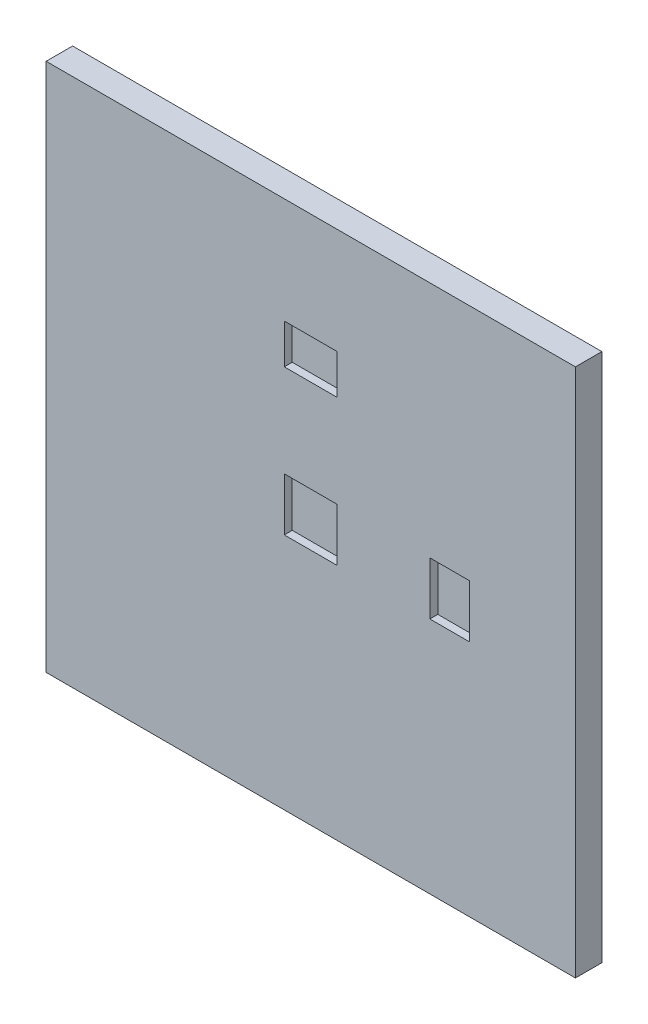
ISO-10303-21;
HEADER;
FILE_DESCRIPTION(('STEP AP214'),'2;1');
FILE_NAME('part.step','',(''),(''),'','','');
FILE_SCHEMA(('AUTOMOTIVE_DESIGN { 1 0 10303 214 1 1 1 1 }'));
ENDSEC;
DATA;
#1=APPLICATION_CONTEXT('core data for automotive mechanical design processes');
#2=APPLICATION_PROTOCOL_DEFINITION('international standard','automotive_design',2000,#1);
#3=PRODUCT_CONTEXT('',#1,'mechanical');
#4=PRODUCT('Part','Part','',(#3));
#5=PRODUCT_RELATED_PRODUCT_CATEGORY('part','',(#4));
#6=PRODUCT_DEFINITION_FORMATION('','',#4);
#7=PRODUCT_DEFINITION_CONTEXT('part definition',#1,'design');
#8=PRODUCT_DEFINITION('design','',#6,#7);
#9=PRODUCT_DEFINITION_SHAPE('','',#8);
#10=(LENGTH_UNIT() NAMED_UNIT(*) SI_UNIT(.MILLI.,.METRE.));
#11=(NAMED_UNIT(*) PLANE_ANGLE_UNIT() SI_UNIT($,.RADIAN.));
#12=(NAMED_UNIT(*) SI_UNIT($,.STERADIAN.) SOLID_ANGLE_UNIT());
#13=UNCERTAINTY_MEASURE_WITH_UNIT(LENGTH_MEASURE(1.E-05),#10,'distance_accuracy_value','');
#14=(GEOMETRIC_REPRESENTATION_CONTEXT(3) GLOBAL_UNCERTAINTY_ASSIGNED_CONTEXT((#13)) GLOBAL_UNIT_ASSIGNED_CONTEXT((#10,
#11,#12)) REPRESENTATION_CONTEXT('',''));
#15=CARTESIAN_POINT('',(0.,0.,0.));
#16=DIRECTION('',(0.,0.,1.));
#17=DIRECTION('',(1.,0.,0.));
#18=AXIS2_PLACEMENT_3D('',#15,#16,#17);
#19=CARTESIAN_POINT('',(0.,0.,10.));
#20=DIRECTION('',(-1.,0.,0.));
#21=DIRECTION('',(0.,-1.,0.));
#22=AXIS2_PLACEMENT_3D('',#19,#20,#21);
#23=PLANE('',#22);
#24=DIRECTION('',(0.,1.,0.));
#25=VECTOR('',#24,1.);
#26=CARTESIAN_POINT('',(0.,0.,0.));
#27=LINE('',#26,#25);
#28=CARTESIAN_POINT('',(0.,-200.,0.));
#29=VERTEX_POINT('',#28);
#30=CARTESIAN_POINT('',(0.,0.,0.));
#31=VERTEX_POINT('',#30);
#32=EDGE_CURVE('E279',#29,#31,#27,.T.);
#33=ORIENTED_EDGE('',*,*,#32,.T.);
#34=DIRECTION('',(0.,0.,-1.));
#35=VECTOR('',#34,1.);
#36=CARTESIAN_POINT('',(0.,0.,10.));
#37=LINE('',#36,#35);
#38=CARTESIAN_POINT('',(0.,0.,10.));
#39=VERTEX_POINT('',#38);
#40=EDGE_CURVE('E11',#39,#31,#37,.T.);
#41=ORIENTED_EDGE('',*,*,#40,.F.);
#42=DIRECTION('',(0.,1.,0.));
#43=VECTOR('',#42,1.);
#44=CARTESIAN_POINT('',(0.,0.,10.));
#45=LINE('',#44,#43);
#46=CARTESIAN_POINT('',(0.,-200.,10.));
#47=VERTEX_POINT('',#46);
#48=EDGE_CURVE('E289',#47,#39,#45,.T.);
#49=ORIENTED_EDGE('',*,*,#48,.F.);
#50=DIRECTION('',(0.,0.,-1.));
#51=VECTOR('',#50,1.);
#52=CARTESIAN_POINT('',(0.,-200.,10.));
#53=LINE('',#52,#51);
#54=EDGE_CURVE('E303',#47,#29,#53,.T.);
#55=ORIENTED_EDGE('',*,*,#54,.T.);
#56=EDGE_LOOP('',(#33,#41,#49,#55));
#57=FACE_BOUND('',#56,.T.);
#58=ADVANCED_FACE('F39',(#57),#23,.F.);
#59=CARTESIAN_POINT('',(0.,0.,10.));
#60=DIRECTION('',(0.,-1.,0.));
#61=DIRECTION('',(0.,0.,-1.));
#62=AXIS2_PLACEMENT_3D('',#59,#60,#61);
#63=PLANE('',#62);
#64=DIRECTION('',(-1.,0.,0.));
#65=VECTOR('',#64,1.);
#66=CARTESIAN_POINT('',(0.,0.,0.));
#67=LINE('',#66,#65);
#68=CARTESIAN_POINT('',(-200.,0.,0.));
#69=VERTEX_POINT('',#68);
#70=EDGE_CURVE('E307',#31,#69,#67,.T.);
#71=ORIENTED_EDGE('',*,*,#70,.T.);
#72=DIRECTION('',(0.,0.,-1.));
#73=VECTOR('',#72,1.);
#74=CARTESIAN_POINT('',(-200.,0.,10.));
#75=LINE('',#74,#73);
#76=CARTESIAN_POINT('',(-200.,0.,10.));
#77=VERTEX_POINT('',#76);
#78=EDGE_CURVE('E47',#77,#69,#75,.T.);
#79=ORIENTED_EDGE('',*,*,#78,.F.);
#80=DIRECTION('',(-1.,0.,0.));
#81=VECTOR('',#80,1.);
#82=CARTESIAN_POINT('',(0.,0.,10.));
#83=LINE('',#82,#81);
#84=EDGE_CURVE('E293',#39,#77,#83,.T.);
#85=ORIENTED_EDGE('',*,*,#84,.F.);
#86=ORIENTED_EDGE('',*,*,#40,.T.);
#87=EDGE_LOOP('',(#71,#79,#85,#86));
#88=FACE_BOUND('',#87,.T.);
#89=ADVANCED_FACE('F343',(#88),#63,.F.);
#90=CARTESIAN_POINT('',(-200.,0.,10.));
#91=DIRECTION('',(1.,0.,0.));
#92=DIRECTION('',(0.,0.,-1.));
#93=AXIS2_PLACEMENT_3D('',#90,#91,#92);
#94=PLANE('',#93);
#95=DIRECTION('',(0.,-1.,0.));
#96=VECTOR('',#95,1.);
#97=CARTESIAN_POINT('',(-200.,0.,0.));
#98=LINE('',#97,#96);
#99=CARTESIAN_POINT('',(-200.,-200.,0.));
#100=VERTEX_POINT('',#99);
#101=EDGE_CURVE('E310',#69,#100,#98,.T.);
#102=ORIENTED_EDGE('',*,*,#101,.T.);
#103=DIRECTION('',(0.,0.,-1.));
#104=VECTOR('',#103,1.);
#105=CARTESIAN_POINT('',(-200.,-200.,10.));
#106=LINE('',#105,#104);
#107=CARTESIAN_POINT('',(-200.,-200.,10.));
#108=VERTEX_POINT('',#107);
#109=EDGE_CURVE('E318',#108,#100,#106,.T.);
#110=ORIENTED_EDGE('',*,*,#109,.F.);
#111=DIRECTION('',(0.,-1.,0.));
#112=VECTOR('',#111,1.);
#113=CARTESIAN_POINT('',(-200.,0.,10.));
#114=LINE('',#113,#112);
#115=EDGE_CURVE('E297',#77,#108,#114,.T.);
#116=ORIENTED_EDGE('',*,*,#115,.F.);
#117=ORIENTED_EDGE('',*,*,#78,.T.);
#118=EDGE_LOOP('',(#102,#110,#116,#117));
#119=FACE_BOUND('',#118,.T.);
#120=ADVANCED_FACE('F327',(#119),#94,.F.);
#121=CARTESIAN_POINT('',(0.,-200.,10.));
#122=DIRECTION('',(0.,1.,0.));
#123=DIRECTION('',(-1.,0.,0.));
#124=AXIS2_PLACEMENT_3D('',#121,#122,#123);
#125=PLANE('',#124);
#126=DIRECTION('',(1.,0.,0.));
#127=VECTOR('',#126,1.);
#128=CARTESIAN_POINT('',(0.,-200.,0.));
#129=LINE('',#128,#127);
#130=EDGE_CURVE('E294',#100,#29,#129,.T.);
#131=ORIENTED_EDGE('',*,*,#130,.T.);
#132=ORIENTED_EDGE('',*,*,#54,.F.);
#133=DIRECTION('',(1.,0.,0.));
#134=VECTOR('',#133,1.);
#135=CARTESIAN_POINT('',(0.,-200.,10.));
#136=LINE('',#135,#134);
#137=EDGE_CURVE('E300',#108,#47,#136,.T.);
#138=ORIENTED_EDGE('',*,*,#137,.F.);
#139=ORIENTED_EDGE('',*,*,#109,.T.);
#140=EDGE_LOOP('',(#131,#132,#138,#139));
#141=FACE_BOUND('',#140,.T.);
#142=ADVANCED_FACE('F336',(#141),#125,.F.);
#143=CARTESIAN_POINT('',(0.,0.,10.));
#144=DIRECTION('',(0.,0.,-1.));
#145=DIRECTION('',(-1.,0.,0.));
#146=AXIS2_PLACEMENT_3D('',#143,#144,#145);
#147=PLANE('',#146);
#148=DIRECTION('',(1.,0.,0.));
#149=VECTOR('',#148,1.);
#150=CARTESIAN_POINT('',(-110.,-55.,10.));
#151=LINE('',#150,#149);
#152=CARTESIAN_POINT('',(-110.,-55.,10.));
#153=VERTEX_POINT('',#152);
#154=CARTESIAN_POINT('',(-90.,-55.,10.));
#155=VERTEX_POINT('',#154);
#156=EDGE_CURVE('E188',#153,#155,#151,.T.);
#157=ORIENTED_EDGE('',*,*,#156,.F.);
#158=DIRECTION('',(0.,-1.,0.));
#159=VECTOR('',#158,1.);
#160=CARTESIAN_POINT('',(-110.,-40.,10.));
#161=LINE('',#160,#159);
#162=CARTESIAN_POINT('',(-110.,-40.,10.));
#163=VERTEX_POINT('',#162);
#164=EDGE_CURVE('E54',#163,#153,#161,.T.);
#165=ORIENTED_EDGE('',*,*,#164,.F.);
#166=DIRECTION('',(-1.,0.,0.));
#167=VECTOR('',#166,1.);
#168=CARTESIAN_POINT('',(-110.,-40.,10.));
#169=LINE('',#168,#167);
#170=CARTESIAN_POINT('',(-90.,-40.,10.));
#171=VERTEX_POINT('',#170);
#172=EDGE_CURVE('E175',#171,#163,#169,.T.);
#173=ORIENTED_EDGE('',*,*,#172,.F.);
#174=DIRECTION('',(0.,1.,0.));
#175=VECTOR('',#174,1.);
#176=CARTESIAN_POINT('',(-90.,-40.,10.));
#177=LINE('',#176,#175);
#178=EDGE_CURVE('E179',#155,#171,#177,.T.);
#179=ORIENTED_EDGE('',*,*,#178,.F.);
#180=EDGE_LOOP('',(#157,#165,#173,#179));
#181=FACE_BOUND('',#180,.T.);
#182=DIRECTION('',(1.,0.,0.));
#183=VECTOR('',#182,1.);
#184=CARTESIAN_POINT('',(-55.,-110.,10.));
#185=LINE('',#184,#183);
#186=CARTESIAN_POINT('',(-55.,-110.,10.));
#187=VERTEX_POINT('',#186);
#188=CARTESIAN_POINT('',(-40.,-110.,10.));
#189=VERTEX_POINT('',#188);
#190=EDGE_CURVE('E224',#187,#189,#185,.T.);
#191=ORIENTED_EDGE('',*,*,#190,.F.);
#192=DIRECTION('',(0.,-1.,0.));
#193=VECTOR('',#192,1.);
#194=CARTESIAN_POINT('',(-55.,-90.,10.));
#195=LINE('',#194,#193);
#196=CARTESIAN_POINT('',(-55.,-90.,10.));
#197=VERTEX_POINT('',#196);
#198=EDGE_CURVE('E62',#197,#187,#195,.T.);
#199=ORIENTED_EDGE('',*,*,#198,.F.);
#200=DIRECTION('',(-1.,0.,0.));
#201=VECTOR('',#200,1.);
#202=CARTESIAN_POINT('',(-55.,-90.,10.));
#203=LINE('',#202,#201);
#204=CARTESIAN_POINT('',(-40.,-90.,10.));
#205=VERTEX_POINT('',#204);
#206=EDGE_CURVE('E209',#205,#197,#203,.T.);
#207=ORIENTED_EDGE('',*,*,#206,.F.);
#208=DIRECTION('',(0.,1.,0.));
#209=VECTOR('',#208,1.);
#210=CARTESIAN_POINT('',(-40.,-90.,10.));
#211=LINE('',#210,#209);
#212=EDGE_CURVE('E228',#189,#205,#211,.T.);
#213=ORIENTED_EDGE('',*,*,#212,.F.);
#214=EDGE_LOOP('',(#191,#199,#207,#213));
#215=FACE_BOUND('',#214,.T.);
#216=DIRECTION('',(1.,0.,0.));
#217=VECTOR('',#216,1.);
#218=CARTESIAN_POINT('',(-110.,-110.,10.));
#219=LINE('',#218,#217);
#220=CARTESIAN_POINT('',(-110.,-110.,10.));
#221=VERTEX_POINT('',#220);
#222=CARTESIAN_POINT('',(-90.,-110.,10.));
#223=VERTEX_POINT('',#222);
#224=EDGE_CURVE('E265',#221,#223,#219,.T.);
#225=ORIENTED_EDGE('',*,*,#224,.F.);
#226=DIRECTION('',(0.,-1.,0.));
#227=VECTOR('',#226,1.);
#228=CARTESIAN_POINT('',(-110.,-90.,10.));
#229=LINE('',#228,#227);
#230=CARTESIAN_POINT('',(-110.,-90.,10.));
#231=VERTEX_POINT('',#230);
#232=EDGE_CURVE('E198',#231,#221,#229,.T.);
#233=ORIENTED_EDGE('',*,*,#232,.F.);
#234=DIRECTION('',(-1.,0.,0.));
#235=VECTOR('',#234,1.);
#236=CARTESIAN_POINT('',(-110.,-90.,10.));
#237=LINE('',#236,#235);
#238=CARTESIAN_POINT('',(-90.,-90.,10.));
#239=VERTEX_POINT('',#238);
#240=EDGE_CURVE('E250',#239,#231,#237,.T.);
#241=ORIENTED_EDGE('',*,*,#240,.F.);
#242=DIRECTION('',(0.,1.,0.));
#243=VECTOR('',#242,1.);
#244=CARTESIAN_POINT('',(-90.,-90.,10.));
#245=LINE('',#244,#243);
#246=EDGE_CURVE('E269',#223,#239,#245,.T.);
#247=ORIENTED_EDGE('',*,*,#246,.F.);
#248=EDGE_LOOP('',(#225,#233,#241,#247));
#249=FACE_BOUND('',#248,.T.);
#250=ORIENTED_EDGE('',*,*,#48,.T.);
#251=ORIENTED_EDGE('',*,*,#84,.T.);
#252=ORIENTED_EDGE('',*,*,#115,.T.);
#253=ORIENTED_EDGE('',*,*,#137,.T.);
#254=EDGE_LOOP('',(#250,#251,#252,#253));
#255=FACE_BOUND('',#254,.T.);
#256=ADVANCED_FACE('F342',(#181,#215,#249,#255),#147,.F.);
#257=CARTESIAN_POINT('',(0.,0.,0.));
#258=DIRECTION('',(0.,0.,-1.));
#259=DIRECTION('',(-1.,0.,0.));
#260=AXIS2_PLACEMENT_3D('',#257,#258,#259);
#261=PLANE('',#260);
#262=ORIENTED_EDGE('',*,*,#32,.F.);
#263=ORIENTED_EDGE('',*,*,#130,.F.);
#264=ORIENTED_EDGE('',*,*,#101,.F.);
#265=ORIENTED_EDGE('',*,*,#70,.F.);
#266=EDGE_LOOP('',(#262,#263,#264,#265));
#267=FACE_BOUND('',#266,.T.);
#268=ADVANCED_FACE('F333',(#267),#261,.T.);
#269=CARTESIAN_POINT('',(-110.,-90.,7.));
#270=DIRECTION('',(-1.,0.,0.));
#271=DIRECTION('',(0.,0.,1.));
#272=AXIS2_PLACEMENT_3D('',#269,#270,#271);
#273=PLANE('',#272);
#274=ORIENTED_EDGE('',*,*,#232,.T.);
#275=DIRECTION('',(0.,0.,1.));
#276=VECTOR('',#275,1.);
#277=CARTESIAN_POINT('',(-110.,-110.,7.));
#278=LINE('',#277,#276);
#279=CARTESIAN_POINT('',(-110.,-110.,7.));
#280=VERTEX_POINT('',#279);
#281=EDGE_CURVE('E262',#280,#221,#278,.T.);
#282=ORIENTED_EDGE('',*,*,#281,.F.);
#283=DIRECTION('',(0.,-1.,0.));
#284=VECTOR('',#283,1.);
#285=CARTESIAN_POINT('',(-110.,-90.,7.));
#286=LINE('',#285,#284);
#287=CARTESIAN_POINT('',(-110.,-90.,7.));
#288=VERTEX_POINT('',#287);
#289=EDGE_CURVE('E245',#288,#280,#286,.T.);
#290=ORIENTED_EDGE('',*,*,#289,.F.);
#291=DIRECTION('',(0.,0.,1.));
#292=VECTOR('',#291,1.);
#293=CARTESIAN_POINT('',(-110.,-90.,7.));
#294=LINE('',#293,#292);
#295=EDGE_CURVE('E276',#288,#231,#294,.T.);
#296=ORIENTED_EDGE('',*,*,#295,.T.);
#297=EDGE_LOOP('',(#274,#282,#290,#296));
#298=FACE_BOUND('',#297,.T.);
#299=ADVANCED_FACE('F355',(#298),#273,.F.);
#300=CARTESIAN_POINT('',(-110.,-90.,7.));
#301=DIRECTION('',(0.,1.,0.));
#302=DIRECTION('',(0.,0.,1.));
#303=AXIS2_PLACEMENT_3D('',#300,#301,#302);
#304=PLANE('',#303);
#305=ORIENTED_EDGE('',*,*,#240,.T.);
#306=ORIENTED_EDGE('',*,*,#295,.F.);
#307=DIRECTION('',(-1.,0.,0.));
#308=VECTOR('',#307,1.);
#309=CARTESIAN_POINT('',(-110.,-90.,7.));
#310=LINE('',#309,#308);
#311=CARTESIAN_POINT('',(-90.,-90.,7.));
#312=VERTEX_POINT('',#311);
#313=EDGE_CURVE('E258',#312,#288,#310,.T.);
#314=ORIENTED_EDGE('',*,*,#313,.F.);
#315=DIRECTION('',(0.,0.,1.));
#316=VECTOR('',#315,1.);
#317=CARTESIAN_POINT('',(-90.,-90.,7.));
#318=LINE('',#317,#316);
#319=EDGE_CURVE('E280',#312,#239,#318,.T.);
#320=ORIENTED_EDGE('',*,*,#319,.T.);
#321=EDGE_LOOP('',(#305,#306,#314,#320));
#322=FACE_BOUND('',#321,.T.);
#323=ADVANCED_FACE('F361',(#322),#304,.F.);
#324=CARTESIAN_POINT('',(-90.,-90.,7.));
#325=DIRECTION('',(1.,0.,0.));
#326=DIRECTION('',(0.,1.,0.));
#327=AXIS2_PLACEMENT_3D('',#324,#325,#326);
#328=PLANE('',#327);
#329=ORIENTED_EDGE('',*,*,#246,.T.);
#330=ORIENTED_EDGE('',*,*,#319,.F.);
#331=DIRECTION('',(0.,1.,0.));
#332=VECTOR('',#331,1.);
#333=CARTESIAN_POINT('',(-90.,-90.,7.));
#334=LINE('',#333,#332);
#335=CARTESIAN_POINT('',(-90.,-110.,7.));
#336=VERTEX_POINT('',#335);
#337=EDGE_CURVE('E254',#336,#312,#334,.T.);
#338=ORIENTED_EDGE('',*,*,#337,.F.);
#339=DIRECTION('',(0.,0.,1.));
#340=VECTOR('',#339,1.);
#341=CARTESIAN_POINT('',(-90.,-110.,7.));
#342=LINE('',#341,#340);
#343=EDGE_CURVE('E283',#336,#223,#342,.T.);
#344=ORIENTED_EDGE('',*,*,#343,.T.);
#345=EDGE_LOOP('',(#329,#330,#338,#344));
#346=FACE_BOUND('',#345,.T.);
#347=ADVANCED_FACE('F367',(#346),#328,.F.);
#348=CARTESIAN_POINT('',(-110.,-110.,7.));
#349=DIRECTION('',(0.,-1.,0.));
#350=DIRECTION('',(0.,0.,-1.));
#351=AXIS2_PLACEMENT_3D('',#348,#349,#350);
#352=PLANE('',#351);
#353=ORIENTED_EDGE('',*,*,#224,.T.);
#354=ORIENTED_EDGE('',*,*,#343,.F.);
#355=DIRECTION('',(1.,0.,0.));
#356=VECTOR('',#355,1.);
#357=CARTESIAN_POINT('',(-110.,-110.,7.));
#358=LINE('',#357,#356);
#359=EDGE_CURVE('E249',#280,#336,#358,.T.);
#360=ORIENTED_EDGE('',*,*,#359,.F.);
#361=ORIENTED_EDGE('',*,*,#281,.T.);
#362=EDGE_LOOP('',(#353,#354,#360,#361));
#363=FACE_BOUND('',#362,.T.);
#364=ADVANCED_FACE('F363',(#363),#352,.F.);
#365=CARTESIAN_POINT('',(0.,0.,7.));
#366=DIRECTION('',(0.,0.,1.));
#367=DIRECTION('',(1.,0.,0.));
#368=AXIS2_PLACEMENT_3D('',#365,#366,#367);
#369=PLANE('',#368);
#370=ORIENTED_EDGE('',*,*,#289,.T.);
#371=ORIENTED_EDGE('',*,*,#359,.T.);
#372=ORIENTED_EDGE('',*,*,#337,.T.);
#373=ORIENTED_EDGE('',*,*,#313,.T.);
#374=EDGE_LOOP('',(#370,#371,#372,#373));
#375=FACE_BOUND('',#374,.T.);
#376=ADVANCED_FACE('F366',(#375),#369,.T.);
#377=CARTESIAN_POINT('',(-55.,-90.,7.));
#378=DIRECTION('',(-1.,0.,0.));
#379=DIRECTION('',(0.,0.,1.));
#380=AXIS2_PLACEMENT_3D('',#377,#378,#379);
#381=PLANE('',#380);
#382=ORIENTED_EDGE('',*,*,#198,.T.);
#383=DIRECTION('',(0.,0.,1.));
#384=VECTOR('',#383,1.);
#385=CARTESIAN_POINT('',(-55.,-110.,7.));
#386=LINE('',#385,#384);
#387=CARTESIAN_POINT('',(-55.,-110.,7.));
#388=VERTEX_POINT('',#387);
#389=EDGE_CURVE('E221',#388,#187,#386,.T.);
#390=ORIENTED_EDGE('',*,*,#389,.F.);
#391=DIRECTION('',(0.,-1.,0.));
#392=VECTOR('',#391,1.);
#393=CARTESIAN_POINT('',(-55.,-90.,7.));
#394=LINE('',#393,#392);
#395=CARTESIAN_POINT('',(-55.,-90.,7.));
#396=VERTEX_POINT('',#395);
#397=EDGE_CURVE('E204',#396,#388,#394,.T.);
#398=ORIENTED_EDGE('',*,*,#397,.F.);
#399=DIRECTION('',(0.,0.,1.));
#400=VECTOR('',#399,1.);
#401=CARTESIAN_POINT('',(-55.,-90.,7.));
#402=LINE('',#401,#400);
#403=EDGE_CURVE('E189',#396,#197,#402,.T.);
#404=ORIENTED_EDGE('',*,*,#403,.T.);
#405=EDGE_LOOP('',(#382,#390,#398,#404));
#406=FACE_BOUND('',#405,.T.);
#407=ADVANCED_FACE('F377',(#406),#381,.F.);
#408=CARTESIAN_POINT('',(-55.,-90.,7.));
#409=DIRECTION('',(0.,1.,0.));
#410=DIRECTION('',(0.,0.,1.));
#411=AXIS2_PLACEMENT_3D('',#408,#409,#410);
#412=PLANE('',#411);
#413=ORIENTED_EDGE('',*,*,#206,.T.);
#414=ORIENTED_EDGE('',*,*,#403,.F.);
#415=DIRECTION('',(-1.,0.,0.));
#416=VECTOR('',#415,1.);
#417=CARTESIAN_POINT('',(-55.,-90.,7.));
#418=LINE('',#417,#416);
#419=CARTESIAN_POINT('',(-40.,-90.,7.));
#420=VERTEX_POINT('',#419);
#421=EDGE_CURVE('E217',#420,#396,#418,.T.);
#422=ORIENTED_EDGE('',*,*,#421,.F.);
#423=DIRECTION('',(0.,0.,1.));
#424=VECTOR('',#423,1.);
#425=CARTESIAN_POINT('',(-40.,-90.,7.));
#426=LINE('',#425,#424);
#427=EDGE_CURVE('E237',#420,#205,#426,.T.);
#428=ORIENTED_EDGE('',*,*,#427,.T.);
#429=EDGE_LOOP('',(#413,#414,#422,#428));
#430=FACE_BOUND('',#429,.T.);
#431=ADVANCED_FACE('F381',(#430),#412,.F.);
#432=CARTESIAN_POINT('',(-40.,-90.,7.));
#433=DIRECTION('',(1.,0.,0.));
#434=DIRECTION('',(0.,0.,-1.));
#435=AXIS2_PLACEMENT_3D('',#432,#433,#434);
#436=PLANE('',#435);
#437=ORIENTED_EDGE('',*,*,#212,.T.);
#438=ORIENTED_EDGE('',*,*,#427,.F.);
#439=DIRECTION('',(0.,1.,0.));
#440=VECTOR('',#439,1.);
#441=CARTESIAN_POINT('',(-40.,-90.,7.));
#442=LINE('',#441,#440);
#443=CARTESIAN_POINT('',(-40.,-110.,7.));
#444=VERTEX_POINT('',#443);
#445=EDGE_CURVE('E213',#444,#420,#442,.T.);
#446=ORIENTED_EDGE('',*,*,#445,.F.);
#447=DIRECTION('',(0.,0.,1.));
#448=VECTOR('',#447,1.);
#449=CARTESIAN_POINT('',(-40.,-110.,7.));
#450=LINE('',#449,#448);
#451=EDGE_CURVE('E240',#444,#189,#450,.T.);
#452=ORIENTED_EDGE('',*,*,#451,.T.);
#453=EDGE_LOOP('',(#437,#438,#446,#452));
#454=FACE_BOUND('',#453,.T.);
#455=ADVANCED_FACE('F386',(#454),#436,.F.);
#456=CARTESIAN_POINT('',(-55.,-110.,7.));
#457=DIRECTION('',(0.,-1.,0.));
#458=DIRECTION('',(0.,0.,-1.));
#459=AXIS2_PLACEMENT_3D('',#456,#457,#458);
#460=PLANE('',#459);
#461=ORIENTED_EDGE('',*,*,#190,.T.);
#462=ORIENTED_EDGE('',*,*,#451,.F.);
#463=DIRECTION('',(1.,0.,0.));
#464=VECTOR('',#463,1.);
#465=CARTESIAN_POINT('',(-55.,-110.,7.));
#466=LINE('',#465,#464);
#467=EDGE_CURVE('E208',#388,#444,#466,.T.);
#468=ORIENTED_EDGE('',*,*,#467,.F.);
#469=ORIENTED_EDGE('',*,*,#389,.T.);
#470=EDGE_LOOP('',(#461,#462,#468,#469));
#471=FACE_BOUND('',#470,.T.);
#472=ADVANCED_FACE('F382',(#471),#460,.F.);
#473=CARTESIAN_POINT('',(0.,0.,7.));
#474=DIRECTION('',(0.,0.,1.));
#475=DIRECTION('',(1.,0.,0.));
#476=AXIS2_PLACEMENT_3D('',#473,#474,#475);
#477=PLANE('',#476);
#478=ORIENTED_EDGE('',*,*,#397,.T.);
#479=ORIENTED_EDGE('',*,*,#467,.T.);
#480=ORIENTED_EDGE('',*,*,#445,.T.);
#481=ORIENTED_EDGE('',*,*,#421,.T.);
#482=EDGE_LOOP('',(#478,#479,#480,#481));
#483=FACE_BOUND('',#482,.T.);
#484=ADVANCED_FACE('F385',(#483),#477,.T.);
#485=CARTESIAN_POINT('',(-110.,-40.,7.));
#486=DIRECTION('',(-1.,0.,0.));
#487=DIRECTION('',(0.,0.,1.));
#488=AXIS2_PLACEMENT_3D('',#485,#486,#487);
#489=PLANE('',#488);
#490=ORIENTED_EDGE('',*,*,#164,.T.);
#491=DIRECTION('',(0.,0.,1.));
#492=VECTOR('',#491,1.);
#493=CARTESIAN_POINT('',(-110.,-55.,7.));
#494=LINE('',#493,#492);
#495=CARTESIAN_POINT('',(-110.,-55.,7.));
#496=VERTEX_POINT('',#495);
#497=EDGE_CURVE('E150',#496,#153,#494,.T.);
#498=ORIENTED_EDGE('',*,*,#497,.F.);
#499=DIRECTION('',(0.,-1.,0.));
#500=VECTOR('',#499,1.);
#501=CARTESIAN_POINT('',(-110.,-40.,7.));
#502=LINE('',#501,#500);
#503=CARTESIAN_POINT('',(-110.,-40.,7.));
#504=VERTEX_POINT('',#503);
#505=EDGE_CURVE('E154',#504,#496,#502,.T.);
#506=ORIENTED_EDGE('',*,*,#505,.F.);
#507=DIRECTION('',(0.,0.,1.));
#508=VECTOR('',#507,1.);
#509=CARTESIAN_POINT('',(-110.,-40.,7.));
#510=LINE('',#509,#508);
#511=EDGE_CURVE('E195',#504,#163,#510,.T.);
#512=ORIENTED_EDGE('',*,*,#511,.T.);
#513=EDGE_LOOP('',(#490,#498,#506,#512));
#514=FACE_BOUND('',#513,.T.);
#515=ADVANCED_FACE('F152',(#514),#489,.F.);
#516=CARTESIAN_POINT('',(-110.,-40.,7.));
#517=DIRECTION('',(0.,1.,0.));
#518=DIRECTION('',(0.,0.,1.));
#519=AXIS2_PLACEMENT_3D('',#516,#517,#518);
#520=PLANE('',#519);
#521=ORIENTED_EDGE('',*,*,#172,.T.);
#522=ORIENTED_EDGE('',*,*,#511,.F.);
#523=DIRECTION('',(-1.,0.,0.));
#524=VECTOR('',#523,1.);
#525=CARTESIAN_POINT('',(-110.,-40.,7.));
#526=LINE('',#525,#524);
#527=CARTESIAN_POINT('',(-90.,-40.,7.));
#528=VERTEX_POINT('',#527);
#529=EDGE_CURVE('E161',#528,#504,#526,.T.);
#530=ORIENTED_EDGE('',*,*,#529,.F.);
#531=DIRECTION('',(0.,0.,1.));
#532=VECTOR('',#531,1.);
#533=CARTESIAN_POINT('',(-90.,-40.,7.));
#534=LINE('',#533,#532);
#535=EDGE_CURVE('E199',#528,#171,#534,.T.);
#536=ORIENTED_EDGE('',*,*,#535,.T.);
#537=EDGE_LOOP('',(#521,#522,#530,#536));
#538=FACE_BOUND('',#537,.T.);
#539=ADVANCED_FACE('F399',(#538),#520,.F.);
#540=CARTESIAN_POINT('',(-90.,-40.,7.));
#541=DIRECTION('',(1.,0.,0.));
#542=DIRECTION('',(0.,1.,0.));
#543=AXIS2_PLACEMENT_3D('',#540,#541,#542);
#544=PLANE('',#543);
#545=ORIENTED_EDGE('',*,*,#178,.T.);
#546=ORIENTED_EDGE('',*,*,#535,.F.);
#547=DIRECTION('',(0.,1.,0.));
#548=VECTOR('',#547,1.);
#549=CARTESIAN_POINT('',(-90.,-40.,7.));
#550=LINE('',#549,#548);
#551=CARTESIAN_POINT('',(-90.,-55.,7.));
#552=VERTEX_POINT('',#551);
#553=EDGE_CURVE('E170',#552,#528,#550,.T.);
#554=ORIENTED_EDGE('',*,*,#553,.F.);
#555=DIRECTION('',(0.,0.,1.));
#556=VECTOR('',#555,1.);
#557=CARTESIAN_POINT('',(-90.,-55.,7.));
#558=LINE('',#557,#556);
#559=EDGE_CURVE('E160',#552,#155,#558,.T.);
#560=ORIENTED_EDGE('',*,*,#559,.T.);
#561=EDGE_LOOP('',(#545,#546,#554,#560));
#562=FACE_BOUND('',#561,.T.);
#563=ADVANCED_FACE('F402',(#562),#544,.F.);
#564=CARTESIAN_POINT('',(-110.,-55.,7.));
#565=DIRECTION('',(0.,-1.,0.));
#566=DIRECTION('',(0.,0.,-1.));
#567=AXIS2_PLACEMENT_3D('',#564,#565,#566);
#568=PLANE('',#567);
#569=ORIENTED_EDGE('',*,*,#156,.T.);
#570=ORIENTED_EDGE('',*,*,#559,.F.);
#571=DIRECTION('',(1.,0.,0.));
#572=VECTOR('',#571,1.);
#573=CARTESIAN_POINT('',(-110.,-55.,7.));
#574=LINE('',#573,#572);
#575=EDGE_CURVE('E164',#496,#552,#574,.T.);
#576=ORIENTED_EDGE('',*,*,#575,.F.);
#577=ORIENTED_EDGE('',*,*,#497,.T.);
#578=EDGE_LOOP('',(#569,#570,#576,#577));
#579=FACE_BOUND('',#578,.T.);
#580=ADVANCED_FACE('F165',(#579),#568,.F.);
#581=CARTESIAN_POINT('',(0.,0.,7.));
#582=DIRECTION('',(0.,0.,1.));
#583=DIRECTION('',(1.,0.,0.));
#584=AXIS2_PLACEMENT_3D('',#581,#582,#583);
#585=PLANE('',#584);
#586=ORIENTED_EDGE('',*,*,#505,.T.);
#587=ORIENTED_EDGE('',*,*,#575,.T.);
#588=ORIENTED_EDGE('',*,*,#553,.T.);
#589=ORIENTED_EDGE('',*,*,#529,.T.);
#590=EDGE_LOOP('',(#586,#587,#588,#589));
#591=FACE_BOUND('',#590,.T.);
#592=ADVANCED_FACE('F172',(#591),#585,.T.);
#593=CLOSED_SHELL('',(#58,#89,#120,#142,#256,#268,#299,#323,#347,#364,#376,#407,#431,#455,#472,
#484,#515,#539,#563,#580,#592));
#594=MANIFOLD_SOLID_BREP('B2',#593);
#595=ADVANCED_BREP_SHAPE_REPRESENTATION('',(#18,#594),#14);
#596=SHAPE_DEFINITION_REPRESENTATION(#9,#595);
ENDSEC;
END-ISO-10303-21;
